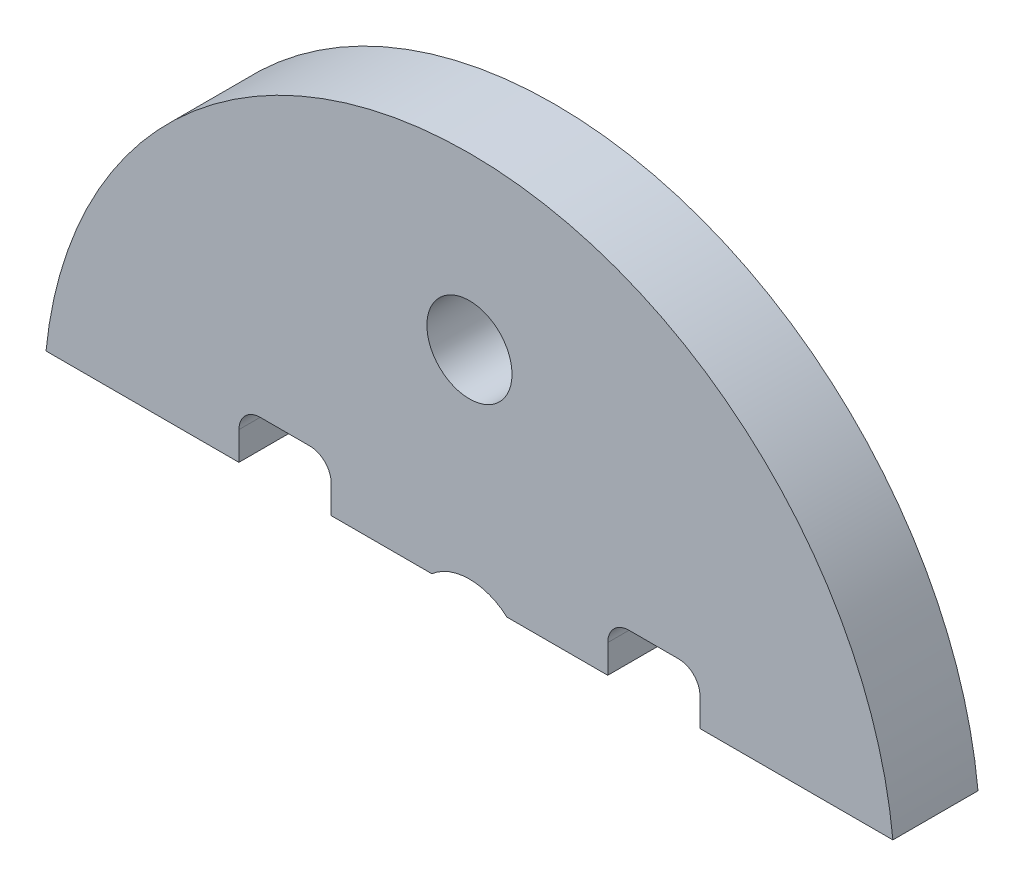
ISO-10303-21;
HEADER;
FILE_DESCRIPTION(('STEP AP214'),'2;1');
FILE_NAME('part.step','',(''),(''),'','','');
FILE_SCHEMA(('AUTOMOTIVE_DESIGN { 1 0 10303 214 1 1 1 1 }'));
ENDSEC;
DATA;
#1=APPLICATION_CONTEXT('core data for automotive mechanical design processes');
#2=APPLICATION_PROTOCOL_DEFINITION('international standard','automotive_design',2000,#1);
#3=PRODUCT_CONTEXT('',#1,'mechanical');
#4=PRODUCT('Part','Part','',(#3));
#5=PRODUCT_RELATED_PRODUCT_CATEGORY('part','',(#4));
#6=PRODUCT_DEFINITION_FORMATION('','',#4);
#7=PRODUCT_DEFINITION_CONTEXT('part definition',#1,'design');
#8=PRODUCT_DEFINITION('design','',#6,#7);
#9=PRODUCT_DEFINITION_SHAPE('','',#8);
#10=(LENGTH_UNIT() NAMED_UNIT(*) SI_UNIT(.MILLI.,.METRE.));
#11=(NAMED_UNIT(*) PLANE_ANGLE_UNIT() SI_UNIT($,.RADIAN.));
#12=(NAMED_UNIT(*) SI_UNIT($,.STERADIAN.) SOLID_ANGLE_UNIT());
#13=UNCERTAINTY_MEASURE_WITH_UNIT(LENGTH_MEASURE(1.E-05),#10,'distance_accuracy_value','');
#14=(GEOMETRIC_REPRESENTATION_CONTEXT(3) GLOBAL_UNCERTAINTY_ASSIGNED_CONTEXT((#13)) GLOBAL_UNIT_ASSIGNED_CONTEXT((#10,
#11,#12)) REPRESENTATION_CONTEXT('',''));
#15=CARTESIAN_POINT('',(0.,0.,0.));
#16=DIRECTION('',(0.,0.,1.));
#17=DIRECTION('',(1.,0.,0.));
#18=AXIS2_PLACEMENT_3D('',#15,#16,#17);
#19=CARTESIAN_POINT('',(221.3728079135,244.4520199932,3.));
#20=DIRECTION('',(0.,0.,1.));
#21=DIRECTION('',(1.,0.,0.));
#22=AXIS2_PLACEMENT_3D('',#19,#20,#21);
#23=PLANE('',#22);
#24=CARTESIAN_POINT('',(221.3728079135,244.4520199932,3.));
#25=DIRECTION('',(0.,0.,-1.));
#26=DIRECTION('',(1.,0.,0.));
#27=AXIS2_PLACEMENT_3D('',#24,#25,#26);
#28=CIRCLE('',#27,0.750000000000001);
#29=CARTESIAN_POINT('',(220.6228079135,244.4520199932,3.));
#30=VERTEX_POINT('',#29);
#31=CARTESIAN_POINT('',(221.3728079135,245.2020199932,3.));
#32=VERTEX_POINT('',#31);
#33=EDGE_CURVE('E209',#30,#32,#28,.T.);
#34=ORIENTED_EDGE('',*,*,#33,.T.);
#35=DIRECTION('',(1.,0.,0.));
#36=VECTOR('',#35,1.);
#37=CARTESIAN_POINT('',(223.1228079135,245.2020199932,3.));
#38=LINE('',#37,#36);
#39=CARTESIAN_POINT('',(223.1228079135,245.2020199932,3.));
#40=VERTEX_POINT('',#39);
#41=EDGE_CURVE('E117',#32,#40,#38,.T.);
#42=ORIENTED_EDGE('',*,*,#41,.T.);
#43=CARTESIAN_POINT('',(223.1228079135,244.4520199932,3.));
#44=DIRECTION('',(0.,0.,-1.));
#45=DIRECTION('',(1.,0.,0.));
#46=AXIS2_PLACEMENT_3D('',#43,#44,#45);
#47=CIRCLE('',#46,0.750000000000001);
#48=CARTESIAN_POINT('',(223.8728079135,244.4520199932,3.));
#49=VERTEX_POINT('',#48);
#50=EDGE_CURVE('E248',#40,#49,#47,.T.);
#51=ORIENTED_EDGE('',*,*,#50,.T.);
#52=DIRECTION('',(0.,-1.,0.));
#53=VECTOR('',#52,1.);
#54=CARTESIAN_POINT('',(223.8728079135,243.4520199932,3.));
#55=LINE('',#54,#53);
#56=CARTESIAN_POINT('',(223.8728079135,243.4520199932,3.));
#57=VERTEX_POINT('',#56);
#58=EDGE_CURVE('E267',#49,#57,#55,.T.);
#59=ORIENTED_EDGE('',*,*,#58,.T.);
#60=DIRECTION('',(1.,0.,0.));
#61=VECTOR('',#60,1.);
#62=CARTESIAN_POINT('',(223.8728079135,243.4520199932,3.));
#63=LINE('',#62,#61);
#64=CARTESIAN_POINT('',(230.6726194701,243.4520199932,3.));
#65=VERTEX_POINT('',#64);
#66=EDGE_CURVE('E264',#57,#65,#63,.T.);
#67=ORIENTED_EDGE('',*,*,#66,.T.);
#68=CARTESIAN_POINT('',(215.7478079135,241.952019993172,3.));
#69=DIRECTION('',(0.,0.,1.));
#70=DIRECTION('',(1.,0.,0.));
#71=AXIS2_PLACEMENT_3D('',#68,#69,#70);
#72=CIRCLE('',#71,15.0000000000035);
#73=CARTESIAN_POINT('',(200.8229963569,243.4520199932,3.));
#74=VERTEX_POINT('',#73);
#75=EDGE_CURVE('E266',#65,#74,#72,.T.);
#76=ORIENTED_EDGE('',*,*,#75,.T.);
#77=DIRECTION('',(1.,0.,0.));
#78=VECTOR('',#77,1.);
#79=CARTESIAN_POINT('',(200.8229963569,243.4520199932,3.));
#80=LINE('',#79,#78);
#81=CARTESIAN_POINT('',(207.6228079135,243.4520199932,3.));
#82=VERTEX_POINT('',#81);
#83=EDGE_CURVE('E269',#74,#82,#80,.T.);
#84=ORIENTED_EDGE('',*,*,#83,.T.);
#85=DIRECTION('',(0.,1.,0.));
#86=VECTOR('',#85,1.);
#87=CARTESIAN_POINT('',(207.6228079135,243.4520199932,3.));
#88=LINE('',#87,#86);
#89=CARTESIAN_POINT('',(207.6228079135,244.4520199932,3.));
#90=VERTEX_POINT('',#89);
#91=EDGE_CURVE('E275',#82,#90,#88,.T.);
#92=ORIENTED_EDGE('',*,*,#91,.T.);
#93=CARTESIAN_POINT('',(208.3728079135,244.4520199932,3.));
#94=DIRECTION('',(0.,0.,-1.));
#95=DIRECTION('',(1.,0.,0.));
#96=AXIS2_PLACEMENT_3D('',#93,#94,#95);
#97=CIRCLE('',#96,0.750000000000001);
#98=CARTESIAN_POINT('',(208.3728079135,245.2020199932,3.));
#99=VERTEX_POINT('',#98);
#100=EDGE_CURVE('E277',#90,#99,#97,.T.);
#101=ORIENTED_EDGE('',*,*,#100,.T.);
#102=DIRECTION('',(1.,0.,0.));
#103=VECTOR('',#102,1.);
#104=CARTESIAN_POINT('',(208.3728079135,245.2020199932,3.));
#105=LINE('',#104,#103);
#106=CARTESIAN_POINT('',(210.1228079135,245.2020199932,3.));
#107=VERTEX_POINT('',#106);
#108=EDGE_CURVE('E279',#99,#107,#105,.T.);
#109=ORIENTED_EDGE('',*,*,#108,.T.);
#110=CARTESIAN_POINT('',(210.1228079135,244.4520199932,3.));
#111=DIRECTION('',(0.,0.,-1.));
#112=DIRECTION('',(1.,0.,0.));
#113=AXIS2_PLACEMENT_3D('',#110,#111,#112);
#114=CIRCLE('',#113,0.750000000000001);
#115=CARTESIAN_POINT('',(210.8728079135,244.4520199932,3.));
#116=VERTEX_POINT('',#115);
#117=EDGE_CURVE('E281',#107,#116,#114,.T.);
#118=ORIENTED_EDGE('',*,*,#117,.T.);
#119=DIRECTION('',(0.,-1.,0.));
#120=VECTOR('',#119,1.);
#121=CARTESIAN_POINT('',(210.8728079135,244.4520199932,3.));
#122=LINE('',#121,#120);
#123=CARTESIAN_POINT('',(210.8728079135,243.4520199932,3.));
#124=VERTEX_POINT('',#123);
#125=EDGE_CURVE('E283',#116,#124,#122,.T.);
#126=ORIENTED_EDGE('',*,*,#125,.T.);
#127=DIRECTION('',(1.,0.,0.));
#128=VECTOR('',#127,1.);
#129=CARTESIAN_POINT('',(210.8728079135,243.4520199932,3.));
#130=LINE('',#129,#128);
#131=CARTESIAN_POINT('',(214.424932258,243.4520199932,3.));
#132=VERTEX_POINT('',#131);
#133=EDGE_CURVE('E160',#124,#132,#130,.T.);
#134=ORIENTED_EDGE('',*,*,#133,.T.);
#135=CARTESIAN_POINT('',(215.7478079135,241.952019993172,3.));
#136=DIRECTION('',(0.,0.,-1.));
#137=DIRECTION('',(1.,0.,0.));
#138=AXIS2_PLACEMENT_3D('',#135,#136,#137);
#139=CIRCLE('',#138,1.99999999999998);
#140=CARTESIAN_POINT('',(217.070683569,243.4520199932,3.));
#141=VERTEX_POINT('',#140);
#142=EDGE_CURVE('E154',#132,#141,#139,.T.);
#143=ORIENTED_EDGE('',*,*,#142,.T.);
#144=DIRECTION('',(1.,0.,0.));
#145=VECTOR('',#144,1.);
#146=CARTESIAN_POINT('',(217.070683569,243.4520199932,3.));
#147=LINE('',#146,#145);
#148=CARTESIAN_POINT('',(220.6228079135,243.4520199932,3.));
#149=VERTEX_POINT('',#148);
#150=EDGE_CURVE('E158',#141,#149,#147,.T.);
#151=ORIENTED_EDGE('',*,*,#150,.T.);
#152=DIRECTION('',(0.,1.,0.));
#153=VECTOR('',#152,1.);
#154=CARTESIAN_POINT('',(220.6228079135,244.4520199932,3.));
#155=LINE('',#154,#153);
#156=EDGE_CURVE('E50',#149,#30,#155,.T.);
#157=ORIENTED_EDGE('',*,*,#156,.T.);
#158=EDGE_LOOP('',(#34,#42,#51,#59,#67,#76,#84,#92,#101,#109,#118,#126,#134,#143,#151,#157));
#159=FACE_BOUND('',#158,.T.);
#160=CARTESIAN_POINT('',(215.7478079135,250.9520199932,3.));
#161=DIRECTION('',(0.,0.,1.));
#162=DIRECTION('',(1.,0.,0.));
#163=AXIS2_PLACEMENT_3D('',#160,#161,#162);
#164=CIRCLE('',#163,1.5);
#165=CARTESIAN_POINT('',(217.2478079135,250.9520199932,3.));
#166=VERTEX_POINT('',#165);
#167=EDGE_CURVE('E182',#166,#166,#164,.T.);
#168=ORIENTED_EDGE('',*,*,#167,.F.);
#169=EDGE_LOOP('',(#168));
#170=FACE_BOUND('',#169,.T.);
#171=ADVANCED_FACE('F33',(#159,#170),#23,.T.);
#172=CARTESIAN_POINT('',(221.3728079135,244.4520199932,0.));
#173=DIRECTION('',(0.,0.,1.));
#174=DIRECTION('',(1.,0.,0.));
#175=AXIS2_PLACEMENT_3D('',#172,#173,#174);
#176=PLANE('',#175);
#177=CARTESIAN_POINT('',(221.3728079135,244.4520199932,0.));
#178=DIRECTION('',(0.,0.,-1.));
#179=DIRECTION('',(1.,0.,0.));
#180=AXIS2_PLACEMENT_3D('',#177,#178,#179);
#181=CIRCLE('',#180,0.750000000000001);
#182=CARTESIAN_POINT('',(220.6228079135,244.4520199932,0.));
#183=VERTEX_POINT('',#182);
#184=CARTESIAN_POINT('',(221.3728079135,245.2020199932,0.));
#185=VERTEX_POINT('',#184);
#186=EDGE_CURVE('E178',#183,#185,#181,.T.);
#187=ORIENTED_EDGE('',*,*,#186,.F.);
#188=DIRECTION('',(0.,1.,0.));
#189=VECTOR('',#188,1.);
#190=CARTESIAN_POINT('',(220.6228079135,244.4520199932,0.));
#191=LINE('',#190,#189);
#192=CARTESIAN_POINT('',(220.6228079135,243.4520199932,0.));
#193=VERTEX_POINT('',#192);
#194=EDGE_CURVE('E109',#193,#183,#191,.T.);
#195=ORIENTED_EDGE('',*,*,#194,.F.);
#196=DIRECTION('',(1.,0.,0.));
#197=VECTOR('',#196,1.);
#198=CARTESIAN_POINT('',(217.070683569,243.4520199932,0.));
#199=LINE('',#198,#197);
#200=CARTESIAN_POINT('',(217.070683569,243.4520199932,0.));
#201=VERTEX_POINT('',#200);
#202=EDGE_CURVE('E103',#201,#193,#199,.T.);
#203=ORIENTED_EDGE('',*,*,#202,.F.);
#204=CARTESIAN_POINT('',(215.7478079135,241.952019993172,0.));
#205=DIRECTION('',(0.,0.,-1.));
#206=DIRECTION('',(1.,0.,0.));
#207=AXIS2_PLACEMENT_3D('',#204,#205,#206);
#208=CIRCLE('',#207,1.99999999999998);
#209=CARTESIAN_POINT('',(214.424932258,243.4520199932,0.));
#210=VERTEX_POINT('',#209);
#211=EDGE_CURVE('E168',#210,#201,#208,.T.);
#212=ORIENTED_EDGE('',*,*,#211,.F.);
#213=DIRECTION('',(1.,0.,0.));
#214=VECTOR('',#213,1.);
#215=CARTESIAN_POINT('',(210.8728079135,243.4520199932,0.));
#216=LINE('',#215,#214);
#217=CARTESIAN_POINT('',(210.8728079135,243.4520199932,0.));
#218=VERTEX_POINT('',#217);
#219=EDGE_CURVE('E204',#218,#210,#216,.T.);
#220=ORIENTED_EDGE('',*,*,#219,.F.);
#221=DIRECTION('',(0.,-1.,0.));
#222=VECTOR('',#221,1.);
#223=CARTESIAN_POINT('',(210.8728079135,244.4520199932,0.));
#224=LINE('',#223,#222);
#225=CARTESIAN_POINT('',(210.8728079135,244.4520199932,0.));
#226=VERTEX_POINT('',#225);
#227=EDGE_CURVE('E202',#226,#218,#224,.T.);
#228=ORIENTED_EDGE('',*,*,#227,.F.);
#229=CARTESIAN_POINT('',(210.1228079135,244.4520199932,0.));
#230=DIRECTION('',(0.,0.,-1.));
#231=DIRECTION('',(1.,0.,0.));
#232=AXIS2_PLACEMENT_3D('',#229,#230,#231);
#233=CIRCLE('',#232,0.750000000000001);
#234=CARTESIAN_POINT('',(210.1228079135,245.2020199932,0.));
#235=VERTEX_POINT('',#234);
#236=EDGE_CURVE('E200',#235,#226,#233,.T.);
#237=ORIENTED_EDGE('',*,*,#236,.F.);
#238=DIRECTION('',(1.,0.,0.));
#239=VECTOR('',#238,1.);
#240=CARTESIAN_POINT('',(208.3728079135,245.2020199932,0.));
#241=LINE('',#240,#239);
#242=CARTESIAN_POINT('',(208.3728079135,245.2020199932,0.));
#243=VERTEX_POINT('',#242);
#244=EDGE_CURVE('E198',#243,#235,#241,.T.);
#245=ORIENTED_EDGE('',*,*,#244,.F.);
#246=CARTESIAN_POINT('',(208.3728079135,244.4520199932,0.));
#247=DIRECTION('',(0.,0.,-1.));
#248=DIRECTION('',(1.,0.,0.));
#249=AXIS2_PLACEMENT_3D('',#246,#247,#248);
#250=CIRCLE('',#249,0.750000000000001);
#251=CARTESIAN_POINT('',(207.6228079135,244.4520199932,0.));
#252=VERTEX_POINT('',#251);
#253=EDGE_CURVE('E196',#252,#243,#250,.T.);
#254=ORIENTED_EDGE('',*,*,#253,.F.);
#255=DIRECTION('',(0.,1.,0.));
#256=VECTOR('',#255,1.);
#257=CARTESIAN_POINT('',(207.6228079135,243.4520199932,0.));
#258=LINE('',#257,#256);
#259=CARTESIAN_POINT('',(207.6228079135,243.4520199932,0.));
#260=VERTEX_POINT('',#259);
#261=EDGE_CURVE('E194',#260,#252,#258,.T.);
#262=ORIENTED_EDGE('',*,*,#261,.F.);
#263=DIRECTION('',(1.,0.,0.));
#264=VECTOR('',#263,1.);
#265=CARTESIAN_POINT('',(200.8229963569,243.4520199932,0.));
#266=LINE('',#265,#264);
#267=CARTESIAN_POINT('',(200.8229963569,243.4520199932,0.));
#268=VERTEX_POINT('',#267);
#269=EDGE_CURVE('E192',#268,#260,#266,.T.);
#270=ORIENTED_EDGE('',*,*,#269,.F.);
#271=CARTESIAN_POINT('',(215.7478079135,241.952019993172,0.));
#272=DIRECTION('',(0.,0.,1.));
#273=DIRECTION('',(1.,0.,0.));
#274=AXIS2_PLACEMENT_3D('',#271,#272,#273);
#275=CIRCLE('',#274,15.0000000000035);
#276=CARTESIAN_POINT('',(230.6726194701,243.4520199932,0.));
#277=VERTEX_POINT('',#276);
#278=EDGE_CURVE('E190',#277,#268,#275,.T.);
#279=ORIENTED_EDGE('',*,*,#278,.F.);
#280=DIRECTION('',(1.,0.,0.));
#281=VECTOR('',#280,1.);
#282=CARTESIAN_POINT('',(223.8728079135,243.4520199932,0.));
#283=LINE('',#282,#281);
#284=CARTESIAN_POINT('',(223.8728079135,243.4520199932,0.));
#285=VERTEX_POINT('',#284);
#286=EDGE_CURVE('E188',#285,#277,#283,.T.);
#287=ORIENTED_EDGE('',*,*,#286,.F.);
#288=DIRECTION('',(0.,-1.,0.));
#289=VECTOR('',#288,1.);
#290=CARTESIAN_POINT('',(223.8728079135,243.4520199932,0.));
#291=LINE('',#290,#289);
#292=CARTESIAN_POINT('',(223.8728079135,244.4520199932,0.));
#293=VERTEX_POINT('',#292);
#294=EDGE_CURVE('E186',#293,#285,#291,.T.);
#295=ORIENTED_EDGE('',*,*,#294,.F.);
#296=CARTESIAN_POINT('',(223.1228079135,244.4520199932,0.));
#297=DIRECTION('',(0.,0.,-1.));
#298=DIRECTION('',(1.,0.,0.));
#299=AXIS2_PLACEMENT_3D('',#296,#297,#298);
#300=CIRCLE('',#299,0.750000000000001);
#301=CARTESIAN_POINT('',(223.1228079135,245.2020199932,0.));
#302=VERTEX_POINT('',#301);
#303=EDGE_CURVE('E184',#302,#293,#300,.T.);
#304=ORIENTED_EDGE('',*,*,#303,.F.);
#305=DIRECTION('',(1.,0.,0.));
#306=VECTOR('',#305,1.);
#307=CARTESIAN_POINT('',(223.1228079135,245.2020199932,0.));
#308=LINE('',#307,#306);
#309=EDGE_CURVE('E181',#185,#302,#308,.T.);
#310=ORIENTED_EDGE('',*,*,#309,.F.);
#311=EDGE_LOOP('',(#187,#195,#203,#212,#220,#228,#237,#245,#254,#262,#270,#279,#287,#295,#304,#310));
#312=FACE_BOUND('',#311,.T.);
#313=CARTESIAN_POINT('',(215.7478079135,250.9520199932,0.));
#314=DIRECTION('',(0.,0.,1.));
#315=DIRECTION('',(1.,0.,0.));
#316=AXIS2_PLACEMENT_3D('',#313,#314,#315);
#317=CIRCLE('',#316,1.5);
#318=CARTESIAN_POINT('',(217.2478079135,250.9520199932,0.));
#319=VERTEX_POINT('',#318);
#320=EDGE_CURVE('E482',#319,#319,#317,.T.);
#321=ORIENTED_EDGE('',*,*,#320,.T.);
#322=EDGE_LOOP('',(#321));
#323=FACE_BOUND('',#322,.T.);
#324=ADVANCED_FACE('F252',(#312,#323),#176,.F.);
#325=CARTESIAN_POINT('',(221.3728079135,244.4520199932,3.));
#326=DIRECTION('',(0.,0.,-1.));
#327=DIRECTION('',(-1.,0.,0.));
#328=AXIS2_PLACEMENT_3D('',#325,#326,#327);
#329=CYLINDRICAL_SURFACE('',#328,0.750000000000001);
#330=ORIENTED_EDGE('',*,*,#186,.T.);
#331=DIRECTION('',(0.,0.,-1.));
#332=VECTOR('',#331,1.);
#333=CARTESIAN_POINT('',(221.3728079135,245.2020199932,3.));
#334=LINE('',#333,#332);
#335=EDGE_CURVE('E11',#32,#185,#334,.T.);
#336=ORIENTED_EDGE('',*,*,#335,.F.);
#337=ORIENTED_EDGE('',*,*,#33,.F.);
#338=DIRECTION('',(0.,0.,-1.));
#339=VECTOR('',#338,1.);
#340=CARTESIAN_POINT('',(220.6228079135,244.4520199932,3.));
#341=LINE('',#340,#339);
#342=EDGE_CURVE('E174',#30,#183,#341,.T.);
#343=ORIENTED_EDGE('',*,*,#342,.T.);
#344=EDGE_LOOP('',(#330,#336,#337,#343));
#345=FACE_BOUND('',#344,.T.);
#346=ADVANCED_FACE('F35',(#345),#329,.F.);
#347=CARTESIAN_POINT('',(223.1228079135,245.2020199932,3.));
#348=DIRECTION('',(0.,1.,0.));
#349=DIRECTION('',(0.,0.,1.));
#350=AXIS2_PLACEMENT_3D('',#347,#348,#349);
#351=PLANE('',#350);
#352=ORIENTED_EDGE('',*,*,#309,.T.);
#353=DIRECTION('',(0.,0.,-1.));
#354=VECTOR('',#353,1.);
#355=CARTESIAN_POINT('',(223.1228079135,245.2020199932,3.));
#356=LINE('',#355,#354);
#357=EDGE_CURVE('E42',#40,#302,#356,.T.);
#358=ORIENTED_EDGE('',*,*,#357,.F.);
#359=ORIENTED_EDGE('',*,*,#41,.F.);
#360=ORIENTED_EDGE('',*,*,#335,.T.);
#361=EDGE_LOOP('',(#352,#358,#359,#360));
#362=FACE_BOUND('',#361,.T.);
#363=ADVANCED_FACE('F317',(#362),#351,.F.);
#364=CARTESIAN_POINT('',(223.1228079135,244.4520199932,3.));
#365=DIRECTION('',(0.,0.,-1.));
#366=DIRECTION('',(-1.,0.,0.));
#367=AXIS2_PLACEMENT_3D('',#364,#365,#366);
#368=CYLINDRICAL_SURFACE('',#367,0.750000000000001);
#369=ORIENTED_EDGE('',*,*,#303,.T.);
#370=DIRECTION('',(0.,0.,-1.));
#371=VECTOR('',#370,1.);
#372=CARTESIAN_POINT('',(223.8728079135,244.4520199932,3.));
#373=LINE('',#372,#371);
#374=EDGE_CURVE('E240',#49,#293,#373,.T.);
#375=ORIENTED_EDGE('',*,*,#374,.F.);
#376=ORIENTED_EDGE('',*,*,#50,.F.);
#377=ORIENTED_EDGE('',*,*,#357,.T.);
#378=EDGE_LOOP('',(#369,#375,#376,#377));
#379=FACE_BOUND('',#378,.T.);
#380=ADVANCED_FACE('F246',(#379),#368,.F.);
#381=CARTESIAN_POINT('',(223.8728079135,243.4520199932,3.));
#382=DIRECTION('',(1.,0.,0.));
#383=DIRECTION('',(0.,0.,-1.));
#384=AXIS2_PLACEMENT_3D('',#381,#382,#383);
#385=PLANE('',#384);
#386=ORIENTED_EDGE('',*,*,#294,.T.);
#387=DIRECTION('',(0.,0.,-1.));
#388=VECTOR('',#387,1.);
#389=CARTESIAN_POINT('',(223.8728079135,243.4520199932,3.));
#390=LINE('',#389,#388);
#391=EDGE_CURVE('E237',#57,#285,#390,.T.);
#392=ORIENTED_EDGE('',*,*,#391,.F.);
#393=ORIENTED_EDGE('',*,*,#58,.F.);
#394=ORIENTED_EDGE('',*,*,#374,.T.);
#395=EDGE_LOOP('',(#386,#392,#393,#394));
#396=FACE_BOUND('',#395,.T.);
#397=ADVANCED_FACE('F258',(#396),#385,.F.);
#398=CARTESIAN_POINT('',(223.8728079135,243.4520199932,3.));
#399=DIRECTION('',(0.,1.,0.));
#400=DIRECTION('',(0.,0.,1.));
#401=AXIS2_PLACEMENT_3D('',#398,#399,#400);
#402=PLANE('',#401);
#403=ORIENTED_EDGE('',*,*,#286,.T.);
#404=DIRECTION('',(0.,0.,-1.));
#405=VECTOR('',#404,1.);
#406=CARTESIAN_POINT('',(230.6726194701,243.4520199932,3.));
#407=LINE('',#406,#405);
#408=EDGE_CURVE('E234',#65,#277,#407,.T.);
#409=ORIENTED_EDGE('',*,*,#408,.F.);
#410=ORIENTED_EDGE('',*,*,#66,.F.);
#411=ORIENTED_EDGE('',*,*,#391,.T.);
#412=EDGE_LOOP('',(#403,#409,#410,#411));
#413=FACE_BOUND('',#412,.T.);
#414=ADVANCED_FACE('F262',(#413),#402,.F.);
#415=CARTESIAN_POINT('',(215.7478079135,241.952019993172,3.));
#416=DIRECTION('',(0.,0.,-1.));
#417=DIRECTION('',(-1.,0.,0.));
#418=AXIS2_PLACEMENT_3D('',#415,#416,#417);
#419=CYLINDRICAL_SURFACE('',#418,15.0000000000035);
#420=ORIENTED_EDGE('',*,*,#278,.T.);
#421=DIRECTION('',(0.,0.,-1.));
#422=VECTOR('',#421,1.);
#423=CARTESIAN_POINT('',(200.8229963569,243.4520199932,3.));
#424=LINE('',#423,#422);
#425=EDGE_CURVE('E231',#74,#268,#424,.T.);
#426=ORIENTED_EDGE('',*,*,#425,.F.);
#427=ORIENTED_EDGE('',*,*,#75,.F.);
#428=ORIENTED_EDGE('',*,*,#408,.T.);
#429=EDGE_LOOP('',(#420,#426,#427,#428));
#430=FACE_BOUND('',#429,.T.);
#431=ADVANCED_FACE('F330',(#430),#419,.T.);
#432=CARTESIAN_POINT('',(200.8229963569,243.4520199932,3.));
#433=DIRECTION('',(0.,1.,0.));
#434=DIRECTION('',(0.,0.,1.));
#435=AXIS2_PLACEMENT_3D('',#432,#433,#434);
#436=PLANE('',#435);
#437=ORIENTED_EDGE('',*,*,#269,.T.);
#438=DIRECTION('',(0.,0.,-1.));
#439=VECTOR('',#438,1.);
#440=CARTESIAN_POINT('',(207.6228079135,243.4520199932,3.));
#441=LINE('',#440,#439);
#442=EDGE_CURVE('E228',#82,#260,#441,.T.);
#443=ORIENTED_EDGE('',*,*,#442,.F.);
#444=ORIENTED_EDGE('',*,*,#83,.F.);
#445=ORIENTED_EDGE('',*,*,#425,.T.);
#446=EDGE_LOOP('',(#437,#443,#444,#445));
#447=FACE_BOUND('',#446,.T.);
#448=ADVANCED_FACE('F333',(#447),#436,.F.);
#449=CARTESIAN_POINT('',(207.6228079135,243.4520199932,3.));
#450=DIRECTION('',(-1.,0.,0.));
#451=DIRECTION('',(0.,0.,1.));
#452=AXIS2_PLACEMENT_3D('',#449,#450,#451);
#453=PLANE('',#452);
#454=ORIENTED_EDGE('',*,*,#261,.T.);
#455=DIRECTION('',(0.,0.,-1.));
#456=VECTOR('',#455,1.);
#457=CARTESIAN_POINT('',(207.6228079135,244.4520199932,3.));
#458=LINE('',#457,#456);
#459=EDGE_CURVE('E225',#90,#252,#458,.T.);
#460=ORIENTED_EDGE('',*,*,#459,.F.);
#461=ORIENTED_EDGE('',*,*,#91,.F.);
#462=ORIENTED_EDGE('',*,*,#442,.T.);
#463=EDGE_LOOP('',(#454,#460,#461,#462));
#464=FACE_BOUND('',#463,.T.);
#465=ADVANCED_FACE('F337',(#464),#453,.F.);
#466=CARTESIAN_POINT('',(208.3728079135,244.4520199932,3.));
#467=DIRECTION('',(0.,0.,-1.));
#468=DIRECTION('',(-1.,0.,0.));
#469=AXIS2_PLACEMENT_3D('',#466,#467,#468);
#470=CYLINDRICAL_SURFACE('',#469,0.750000000000001);
#471=ORIENTED_EDGE('',*,*,#253,.T.);
#472=DIRECTION('',(0.,0.,-1.));
#473=VECTOR('',#472,1.);
#474=CARTESIAN_POINT('',(208.3728079135,245.2020199932,3.));
#475=LINE('',#474,#473);
#476=EDGE_CURVE('E222',#99,#243,#475,.T.);
#477=ORIENTED_EDGE('',*,*,#476,.F.);
#478=ORIENTED_EDGE('',*,*,#100,.F.);
#479=ORIENTED_EDGE('',*,*,#459,.T.);
#480=EDGE_LOOP('',(#471,#477,#478,#479));
#481=FACE_BOUND('',#480,.T.);
#482=ADVANCED_FACE('F341',(#481),#470,.F.);
#483=CARTESIAN_POINT('',(208.3728079135,245.2020199932,3.));
#484=DIRECTION('',(0.,1.,0.));
#485=DIRECTION('',(0.,0.,1.));
#486=AXIS2_PLACEMENT_3D('',#483,#484,#485);
#487=PLANE('',#486);
#488=ORIENTED_EDGE('',*,*,#244,.T.);
#489=DIRECTION('',(0.,0.,-1.));
#490=VECTOR('',#489,1.);
#491=CARTESIAN_POINT('',(210.1228079135,245.2020199932,3.));
#492=LINE('',#491,#490);
#493=EDGE_CURVE('E219',#107,#235,#492,.T.);
#494=ORIENTED_EDGE('',*,*,#493,.F.);
#495=ORIENTED_EDGE('',*,*,#108,.F.);
#496=ORIENTED_EDGE('',*,*,#476,.T.);
#497=EDGE_LOOP('',(#488,#494,#495,#496));
#498=FACE_BOUND('',#497,.T.);
#499=ADVANCED_FACE('F345',(#498),#487,.F.);
#500=CARTESIAN_POINT('',(210.1228079135,244.4520199932,3.));
#501=DIRECTION('',(0.,0.,-1.));
#502=DIRECTION('',(-1.,0.,0.));
#503=AXIS2_PLACEMENT_3D('',#500,#501,#502);
#504=CYLINDRICAL_SURFACE('',#503,0.750000000000001);
#505=ORIENTED_EDGE('',*,*,#236,.T.);
#506=DIRECTION('',(0.,0.,-1.));
#507=VECTOR('',#506,1.);
#508=CARTESIAN_POINT('',(210.8728079135,244.4520199932,3.));
#509=LINE('',#508,#507);
#510=EDGE_CURVE('E216',#116,#226,#509,.T.);
#511=ORIENTED_EDGE('',*,*,#510,.F.);
#512=ORIENTED_EDGE('',*,*,#117,.F.);
#513=ORIENTED_EDGE('',*,*,#493,.T.);
#514=EDGE_LOOP('',(#505,#511,#512,#513));
#515=FACE_BOUND('',#514,.T.);
#516=ADVANCED_FACE('F349',(#515),#504,.F.);
#517=CARTESIAN_POINT('',(210.8728079135,244.4520199932,3.));
#518=DIRECTION('',(1.,0.,0.));
#519=DIRECTION('',(0.,0.,-1.));
#520=AXIS2_PLACEMENT_3D('',#517,#518,#519);
#521=PLANE('',#520);
#522=ORIENTED_EDGE('',*,*,#227,.T.);
#523=DIRECTION('',(0.,0.,-1.));
#524=VECTOR('',#523,1.);
#525=CARTESIAN_POINT('',(210.8728079135,243.4520199932,3.));
#526=LINE('',#525,#524);
#527=EDGE_CURVE('E213',#124,#218,#526,.T.);
#528=ORIENTED_EDGE('',*,*,#527,.F.);
#529=ORIENTED_EDGE('',*,*,#125,.F.);
#530=ORIENTED_EDGE('',*,*,#510,.T.);
#531=EDGE_LOOP('',(#522,#528,#529,#530));
#532=FACE_BOUND('',#531,.T.);
#533=ADVANCED_FACE('F289',(#532),#521,.F.);
#534=CARTESIAN_POINT('',(210.8728079135,243.4520199932,3.));
#535=DIRECTION('',(0.,1.,0.));
#536=DIRECTION('',(0.,0.,1.));
#537=AXIS2_PLACEMENT_3D('',#534,#535,#536);
#538=PLANE('',#537);
#539=ORIENTED_EDGE('',*,*,#219,.T.);
#540=DIRECTION('',(0.,0.,-1.));
#541=VECTOR('',#540,1.);
#542=CARTESIAN_POINT('',(214.424932258,243.4520199932,3.));
#543=LINE('',#542,#541);
#544=EDGE_CURVE('E169',#132,#210,#543,.T.);
#545=ORIENTED_EDGE('',*,*,#544,.F.);
#546=ORIENTED_EDGE('',*,*,#133,.F.);
#547=ORIENTED_EDGE('',*,*,#527,.T.);
#548=EDGE_LOOP('',(#539,#545,#546,#547));
#549=FACE_BOUND('',#548,.T.);
#550=ADVANCED_FACE('F293',(#549),#538,.F.);
#551=CARTESIAN_POINT('',(215.7478079135,241.952019993172,3.));
#552=DIRECTION('',(0.,0.,-1.));
#553=DIRECTION('',(-1.,0.,0.));
#554=AXIS2_PLACEMENT_3D('',#551,#552,#553);
#555=CYLINDRICAL_SURFACE('',#554,1.99999999999998);
#556=ORIENTED_EDGE('',*,*,#211,.T.);
#557=DIRECTION('',(0.,0.,-1.));
#558=VECTOR('',#557,1.);
#559=CARTESIAN_POINT('',(217.070683569,243.4520199932,3.));
#560=LINE('',#559,#558);
#561=EDGE_CURVE('E165',#141,#201,#560,.T.);
#562=ORIENTED_EDGE('',*,*,#561,.F.);
#563=ORIENTED_EDGE('',*,*,#142,.F.);
#564=ORIENTED_EDGE('',*,*,#544,.T.);
#565=EDGE_LOOP('',(#556,#562,#563,#564));
#566=FACE_BOUND('',#565,.T.);
#567=ADVANCED_FACE('F166',(#566),#555,.F.);
#568=CARTESIAN_POINT('',(217.070683569,243.4520199932,3.));
#569=DIRECTION('',(0.,1.,0.));
#570=DIRECTION('',(0.,0.,1.));
#571=AXIS2_PLACEMENT_3D('',#568,#569,#570);
#572=PLANE('',#571);
#573=ORIENTED_EDGE('',*,*,#202,.T.);
#574=DIRECTION('',(0.,0.,-1.));
#575=VECTOR('',#574,1.);
#576=CARTESIAN_POINT('',(220.6228079135,243.4520199932,3.));
#577=LINE('',#576,#575);
#578=EDGE_CURVE('E170',#149,#193,#577,.T.);
#579=ORIENTED_EDGE('',*,*,#578,.F.);
#580=ORIENTED_EDGE('',*,*,#150,.F.);
#581=ORIENTED_EDGE('',*,*,#561,.T.);
#582=EDGE_LOOP('',(#573,#579,#580,#581));
#583=FACE_BOUND('',#582,.T.);
#584=ADVANCED_FACE('F172',(#583),#572,.F.);
#585=CARTESIAN_POINT('',(220.6228079135,244.4520199932,3.));
#586=DIRECTION('',(-1.,0.,0.));
#587=DIRECTION('',(0.,0.,1.));
#588=AXIS2_PLACEMENT_3D('',#585,#586,#587);
#589=PLANE('',#588);
#590=ORIENTED_EDGE('',*,*,#194,.T.);
#591=ORIENTED_EDGE('',*,*,#342,.F.);
#592=ORIENTED_EDGE('',*,*,#156,.F.);
#593=ORIENTED_EDGE('',*,*,#578,.T.);
#594=EDGE_LOOP('',(#590,#591,#592,#593));
#595=FACE_BOUND('',#594,.T.);
#596=ADVANCED_FACE('F297',(#595),#589,.F.);
#597=CARTESIAN_POINT('',(215.7478079135,250.9520199932,3.));
#598=DIRECTION('',(0.,0.,-1.));
#599=DIRECTION('',(-1.,0.,0.));
#600=AXIS2_PLACEMENT_3D('',#597,#598,#599);
#601=CYLINDRICAL_SURFACE('',#600,1.5);
#602=ORIENTED_EDGE('',*,*,#167,.T.);
#603=EDGE_LOOP('',(#602));
#604=FACE_BOUND('',#603,.T.);
#605=ORIENTED_EDGE('',*,*,#320,.F.);
#606=EDGE_LOOP('',(#605));
#607=FACE_BOUND('',#606,.T.);
#608=ADVANCED_FACE('F299',(#604,#607),#601,.F.);
#609=CLOSED_SHELL('',(#171,#324,#346,#363,#380,#397,#414,#431,#448,#465,#482,#499,#516,#533,
#550,#567,#584,#596,#608));
#610=MANIFOLD_SOLID_BREP('B2',#609);
#611=ADVANCED_BREP_SHAPE_REPRESENTATION('',(#18,#610),#14);
#612=SHAPE_DEFINITION_REPRESENTATION(#9,#611);
ENDSEC;
END-ISO-10303-21;
